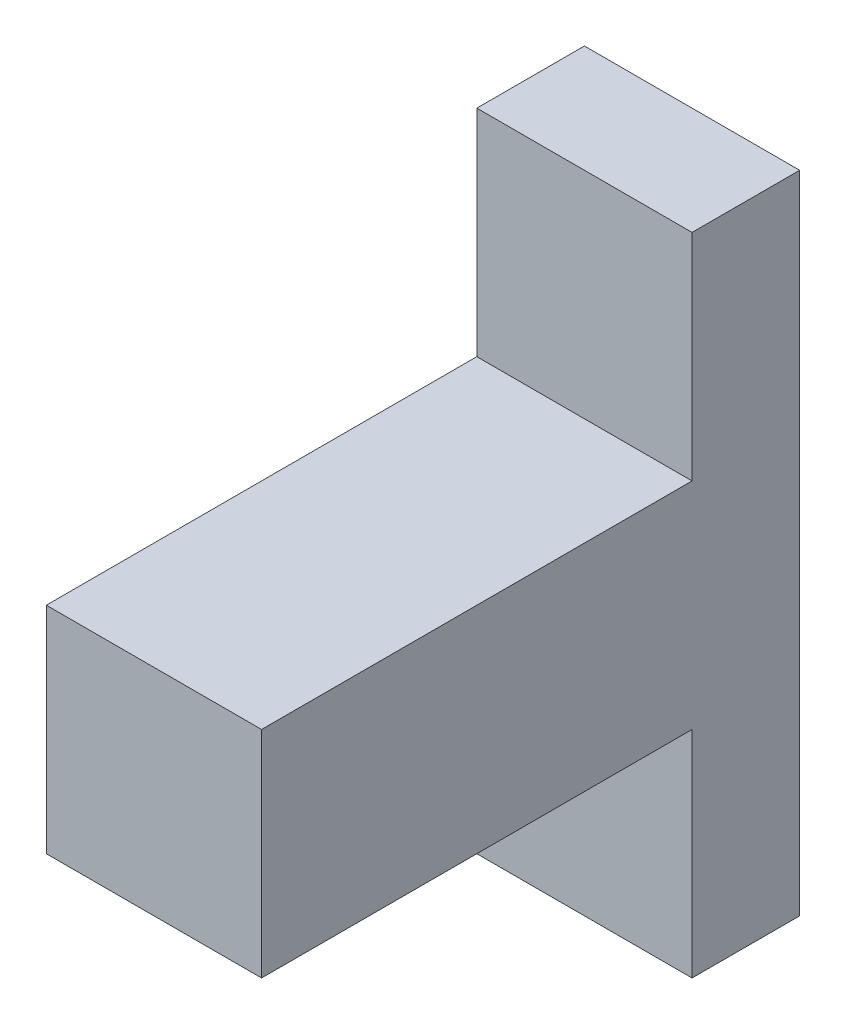
ISO-10303-21;
HEADER;
FILE_DESCRIPTION(('STEP AP214'),'2;1');
FILE_NAME('part.step','',(''),(''),'','','');
FILE_SCHEMA(('AUTOMOTIVE_DESIGN { 1 0 10303 214 1 1 1 1 }'));
ENDSEC;
DATA;
#1=APPLICATION_CONTEXT('core data for automotive mechanical design processes');
#2=APPLICATION_PROTOCOL_DEFINITION('international standard','automotive_design',2000,#1);
#3=PRODUCT_CONTEXT('',#1,'mechanical');
#4=PRODUCT('Part','Part','',(#3));
#5=PRODUCT_RELATED_PRODUCT_CATEGORY('part','',(#4));
#6=PRODUCT_DEFINITION_FORMATION('','',#4);
#7=PRODUCT_DEFINITION_CONTEXT('part definition',#1,'design');
#8=PRODUCT_DEFINITION('design','',#6,#7);
#9=PRODUCT_DEFINITION_SHAPE('','',#8);
#10=(LENGTH_UNIT() NAMED_UNIT(*) SI_UNIT(.MILLI.,.METRE.));
#11=(NAMED_UNIT(*) PLANE_ANGLE_UNIT() SI_UNIT($,.RADIAN.));
#12=(NAMED_UNIT(*) SI_UNIT($,.STERADIAN.) SOLID_ANGLE_UNIT());
#13=UNCERTAINTY_MEASURE_WITH_UNIT(LENGTH_MEASURE(1.E-05),#10,'distance_accuracy_value','');
#14=(GEOMETRIC_REPRESENTATION_CONTEXT(3) GLOBAL_UNCERTAINTY_ASSIGNED_CONTEXT((#13)) GLOBAL_UNIT_ASSIGNED_CONTEXT((#10,
#11,#12)) REPRESENTATION_CONTEXT('',''));
#15=CARTESIAN_POINT('',(0.,0.,0.));
#16=DIRECTION('',(0.,0.,1.));
#17=DIRECTION('',(1.,0.,0.));
#18=AXIS2_PLACEMENT_3D('',#15,#16,#17);
#19=CARTESIAN_POINT('',(-10.,10.,50.));
#20=DIRECTION('',(0.,-1.,0.));
#21=DIRECTION('',(0.,0.,-1.));
#22=AXIS2_PLACEMENT_3D('',#19,#20,#21);
#23=PLANE('',#22);
#24=DIRECTION('',(1.,0.,0.));
#25=VECTOR('',#24,1.);
#26=CARTESIAN_POINT('',(-10.,10.,10.));
#27=LINE('',#26,#25);
#28=CARTESIAN_POINT('',(-10.,10.,10.));
#29=VERTEX_POINT('',#28);
#30=CARTESIAN_POINT('',(10.,10.,10.));
#31=VERTEX_POINT('',#30);
#32=EDGE_CURVE('E61',#29,#31,#27,.T.);
#33=ORIENTED_EDGE('',*,*,#32,.F.);
#34=DIRECTION('',(0.,0.,-1.));
#35=VECTOR('',#34,1.);
#36=CARTESIAN_POINT('',(-10.,10.,50.));
#37=LINE('',#36,#35);
#38=CARTESIAN_POINT('',(-10.,10.,50.));
#39=VERTEX_POINT('',#38);
#40=EDGE_CURVE('E46',#39,#29,#37,.T.);
#41=ORIENTED_EDGE('',*,*,#40,.F.);
#42=DIRECTION('',(-1.,0.,0.));
#43=VECTOR('',#42,1.);
#44=CARTESIAN_POINT('',(-10.,10.,50.));
#45=LINE('',#44,#43);
#46=CARTESIAN_POINT('',(10.,10.,50.));
#47=VERTEX_POINT('',#46);
#48=EDGE_CURVE('E186',#47,#39,#45,.T.);
#49=ORIENTED_EDGE('',*,*,#48,.F.);
#50=DIRECTION('',(0.,0.,-1.));
#51=VECTOR('',#50,1.);
#52=CARTESIAN_POINT('',(10.,10.,50.));
#53=LINE('',#52,#51);
#54=EDGE_CURVE('E11',#47,#31,#53,.T.);
#55=ORIENTED_EDGE('',*,*,#54,.T.);
#56=EDGE_LOOP('',(#33,#41,#49,#55));
#57=FACE_BOUND('',#56,.T.);
#58=ADVANCED_FACE('F37',(#57),#23,.F.);
#59=CARTESIAN_POINT('',(10.,10.,50.));
#60=DIRECTION('',(-1.,0.,0.));
#61=DIRECTION('',(0.,-1.,0.));
#62=AXIS2_PLACEMENT_3D('',#59,#60,#61);
#63=PLANE('',#62);
#64=DIRECTION('',(0.,1.,0.));
#65=VECTOR('',#64,1.);
#66=CARTESIAN_POINT('',(10.,10.,0.));
#67=LINE('',#66,#65);
#68=CARTESIAN_POINT('',(10.,-30.,0.));
#69=VERTEX_POINT('',#68);
#70=CARTESIAN_POINT('',(10.,30.,0.));
#71=VERTEX_POINT('',#70);
#72=EDGE_CURVE('E118',#69,#71,#67,.T.);
#73=ORIENTED_EDGE('',*,*,#72,.T.);
#74=DIRECTION('',(0.,0.,-1.));
#75=VECTOR('',#74,1.);
#76=CARTESIAN_POINT('',(10.,30.,0.));
#77=LINE('',#76,#75);
#78=CARTESIAN_POINT('',(10.,30.,10.));
#79=VERTEX_POINT('',#78);
#80=EDGE_CURVE('E197',#79,#71,#77,.T.);
#81=ORIENTED_EDGE('',*,*,#80,.F.);
#82=DIRECTION('',(0.,-1.,0.));
#83=VECTOR('',#82,1.);
#84=CARTESIAN_POINT('',(10.,30.,10.));
#85=LINE('',#84,#83);
#86=EDGE_CURVE('E177',#79,#31,#85,.T.);
#87=ORIENTED_EDGE('',*,*,#86,.T.);
#88=ORIENTED_EDGE('',*,*,#54,.F.);
#89=DIRECTION('',(0.,1.,0.));
#90=VECTOR('',#89,1.);
#91=CARTESIAN_POINT('',(10.,10.,50.));
#92=LINE('',#91,#90);
#93=CARTESIAN_POINT('',(10.,-10.,50.));
#94=VERTEX_POINT('',#93);
#95=EDGE_CURVE('E117',#94,#47,#92,.T.);
#96=ORIENTED_EDGE('',*,*,#95,.F.);
#97=DIRECTION('',(0.,0.,-1.));
#98=VECTOR('',#97,1.);
#99=CARTESIAN_POINT('',(10.,-10.,50.));
#100=LINE('',#99,#98);
#101=CARTESIAN_POINT('',(10.,-10.,10.));
#102=VERTEX_POINT('',#101);
#103=EDGE_CURVE('E157',#94,#102,#100,.T.);
#104=ORIENTED_EDGE('',*,*,#103,.T.);
#105=DIRECTION('',(0.,1.,0.));
#106=VECTOR('',#105,1.);
#107=CARTESIAN_POINT('',(10.,-30.,10.));
#108=LINE('',#107,#106);
#109=CARTESIAN_POINT('',(10.,-30.,10.));
#110=VERTEX_POINT('',#109);
#111=EDGE_CURVE('E54',#110,#102,#108,.T.);
#112=ORIENTED_EDGE('',*,*,#111,.F.);
#113=DIRECTION('',(0.,0.,-1.));
#114=VECTOR('',#113,1.);
#115=CARTESIAN_POINT('',(10.,-30.,0.));
#116=LINE('',#115,#114);
#117=EDGE_CURVE('E130',#110,#69,#116,.T.);
#118=ORIENTED_EDGE('',*,*,#117,.T.);
#119=EDGE_LOOP('',(#73,#81,#87,#88,#96,#104,#112,#118));
#120=FACE_BOUND('',#119,.T.);
#121=ADVANCED_FACE('F39',(#120),#63,.F.);
#122=CARTESIAN_POINT('',(-10.,10.,50.));
#123=DIRECTION('',(1.,0.,0.));
#124=DIRECTION('',(0.,1.,0.));
#125=AXIS2_PLACEMENT_3D('',#122,#123,#124);
#126=PLANE('',#125);
#127=DIRECTION('',(0.,-1.,0.));
#128=VECTOR('',#127,1.);
#129=CARTESIAN_POINT('',(-10.,10.,0.));
#130=LINE('',#129,#128);
#131=CARTESIAN_POINT('',(-10.,30.,0.));
#132=VERTEX_POINT('',#131);
#133=CARTESIAN_POINT('',(-10.,-30.,0.));
#134=VERTEX_POINT('',#133);
#135=EDGE_CURVE('E105',#132,#134,#130,.T.);
#136=ORIENTED_EDGE('',*,*,#135,.T.);
#137=DIRECTION('',(0.,0.,1.));
#138=VECTOR('',#137,1.);
#139=CARTESIAN_POINT('',(-10.,-30.,0.));
#140=LINE('',#139,#138);
#141=CARTESIAN_POINT('',(-10.,-30.,10.));
#142=VERTEX_POINT('',#141);
#143=EDGE_CURVE('E108',#134,#142,#140,.T.);
#144=ORIENTED_EDGE('',*,*,#143,.T.);
#145=DIRECTION('',(0.,1.,0.));
#146=VECTOR('',#145,1.);
#147=CARTESIAN_POINT('',(-10.,-30.,10.));
#148=LINE('',#147,#146);
#149=CARTESIAN_POINT('',(-10.,-10.,10.));
#150=VERTEX_POINT('',#149);
#151=EDGE_CURVE('E135',#142,#150,#148,.T.);
#152=ORIENTED_EDGE('',*,*,#151,.T.);
#153=DIRECTION('',(0.,0.,-1.));
#154=VECTOR('',#153,1.);
#155=CARTESIAN_POINT('',(-10.,-10.,50.));
#156=LINE('',#155,#154);
#157=CARTESIAN_POINT('',(-10.,-10.,50.));
#158=VERTEX_POINT('',#157);
#159=EDGE_CURVE('E142',#158,#150,#156,.T.);
#160=ORIENTED_EDGE('',*,*,#159,.F.);
#161=DIRECTION('',(0.,-1.,0.));
#162=VECTOR('',#161,1.);
#163=CARTESIAN_POINT('',(-10.,10.,50.));
#164=LINE('',#163,#162);
#165=EDGE_CURVE('E161',#39,#158,#164,.T.);
#166=ORIENTED_EDGE('',*,*,#165,.F.);
#167=ORIENTED_EDGE('',*,*,#40,.T.);
#168=DIRECTION('',(0.,-1.,0.));
#169=VECTOR('',#168,1.);
#170=CARTESIAN_POINT('',(-10.,30.,10.));
#171=LINE('',#170,#169);
#172=CARTESIAN_POINT('',(-10.,30.,10.));
#173=VERTEX_POINT('',#172);
#174=EDGE_CURVE('E188',#173,#29,#171,.T.);
#175=ORIENTED_EDGE('',*,*,#174,.F.);
#176=DIRECTION('',(0.,0.,1.));
#177=VECTOR('',#176,1.);
#178=CARTESIAN_POINT('',(-10.,30.,0.));
#179=LINE('',#178,#177);
#180=EDGE_CURVE('E112',#132,#173,#179,.T.);
#181=ORIENTED_EDGE('',*,*,#180,.F.);
#182=EDGE_LOOP('',(#136,#144,#152,#160,#166,#167,#175,#181));
#183=FACE_BOUND('',#182,.T.);
#184=ADVANCED_FACE('F107',(#183),#126,.F.);
#185=CARTESIAN_POINT('',(-10.,-10.,50.));
#186=DIRECTION('',(0.,1.,0.));
#187=DIRECTION('',(0.,0.,1.));
#188=AXIS2_PLACEMENT_3D('',#185,#186,#187);
#189=PLANE('',#188);
#190=ORIENTED_EDGE('',*,*,#159,.T.);
#191=DIRECTION('',(1.,0.,0.));
#192=VECTOR('',#191,1.);
#193=CARTESIAN_POINT('',(-10.,-10.,10.));
#194=LINE('',#193,#192);
#195=EDGE_CURVE('E127',#150,#102,#194,.T.);
#196=ORIENTED_EDGE('',*,*,#195,.T.);
#197=ORIENTED_EDGE('',*,*,#103,.F.);
#198=DIRECTION('',(1.,0.,0.));
#199=VECTOR('',#198,1.);
#200=CARTESIAN_POINT('',(-10.,-10.,50.));
#201=LINE('',#200,#199);
#202=EDGE_CURVE('E156',#158,#94,#201,.T.);
#203=ORIENTED_EDGE('',*,*,#202,.F.);
#204=EDGE_LOOP('',(#190,#196,#197,#203));
#205=FACE_BOUND('',#204,.T.);
#206=ADVANCED_FACE('F155',(#205),#189,.F.);
#207=CARTESIAN_POINT('',(0.,0.,50.));
#208=DIRECTION('',(0.,0.,1.));
#209=DIRECTION('',(1.,0.,0.));
#210=AXIS2_PLACEMENT_3D('',#207,#208,#209);
#211=PLANE('',#210);
#212=ORIENTED_EDGE('',*,*,#95,.T.);
#213=ORIENTED_EDGE('',*,*,#48,.T.);
#214=ORIENTED_EDGE('',*,*,#165,.T.);
#215=ORIENTED_EDGE('',*,*,#202,.T.);
#216=EDGE_LOOP('',(#212,#213,#214,#215));
#217=FACE_BOUND('',#216,.T.);
#218=ADVANCED_FACE('F202',(#217),#211,.T.);
#219=CARTESIAN_POINT('',(0.,0.,0.));
#220=DIRECTION('',(0.,0.,1.));
#221=DIRECTION('',(1.,0.,0.));
#222=AXIS2_PLACEMENT_3D('',#219,#220,#221);
#223=PLANE('',#222);
#224=ORIENTED_EDGE('',*,*,#72,.F.);
#225=DIRECTION('',(-1.,0.,0.));
#226=VECTOR('',#225,1.);
#227=CARTESIAN_POINT('',(-10.,-30.,0.));
#228=LINE('',#227,#226);
#229=EDGE_CURVE('E124',#69,#134,#228,.T.);
#230=ORIENTED_EDGE('',*,*,#229,.T.);
#231=ORIENTED_EDGE('',*,*,#135,.F.);
#232=DIRECTION('',(-1.,0.,0.));
#233=VECTOR('',#232,1.);
#234=CARTESIAN_POINT('',(-10.,30.,0.));
#235=LINE('',#234,#233);
#236=EDGE_CURVE('E182',#71,#132,#235,.T.);
#237=ORIENTED_EDGE('',*,*,#236,.F.);
#238=EDGE_LOOP('',(#224,#230,#231,#237));
#239=FACE_BOUND('',#238,.T.);
#240=ADVANCED_FACE('F129',(#239),#223,.F.);
#241=CARTESIAN_POINT('',(-10.,30.,10.));
#242=DIRECTION('',(0.,0.,-1.));
#243=DIRECTION('',(-1.,0.,0.));
#244=AXIS2_PLACEMENT_3D('',#241,#242,#243);
#245=PLANE('',#244);
#246=ORIENTED_EDGE('',*,*,#32,.T.);
#247=ORIENTED_EDGE('',*,*,#86,.F.);
#248=DIRECTION('',(1.,0.,0.));
#249=VECTOR('',#248,1.);
#250=CARTESIAN_POINT('',(-10.,30.,10.));
#251=LINE('',#250,#249);
#252=EDGE_CURVE('E199',#173,#79,#251,.T.);
#253=ORIENTED_EDGE('',*,*,#252,.F.);
#254=ORIENTED_EDGE('',*,*,#174,.T.);
#255=EDGE_LOOP('',(#246,#247,#253,#254));
#256=FACE_BOUND('',#255,.T.);
#257=ADVANCED_FACE('F216',(#256),#245,.F.);
#258=CARTESIAN_POINT('',(0.,30.,0.));
#259=DIRECTION('',(0.,1.,0.));
#260=DIRECTION('',(0.,0.,1.));
#261=AXIS2_PLACEMENT_3D('',#258,#259,#260);
#262=PLANE('',#261);
#263=ORIENTED_EDGE('',*,*,#180,.T.);
#264=ORIENTED_EDGE('',*,*,#252,.T.);
#265=ORIENTED_EDGE('',*,*,#80,.T.);
#266=ORIENTED_EDGE('',*,*,#236,.T.);
#267=EDGE_LOOP('',(#263,#264,#265,#266));
#268=FACE_BOUND('',#267,.T.);
#269=ADVANCED_FACE('F200',(#268),#262,.T.);
#270=CARTESIAN_POINT('',(-10.,-30.,10.));
#271=DIRECTION('',(0.,0.,1.));
#272=DIRECTION('',(1.,0.,0.));
#273=AXIS2_PLACEMENT_3D('',#270,#271,#272);
#274=PLANE('',#273);
#275=ORIENTED_EDGE('',*,*,#195,.F.);
#276=ORIENTED_EDGE('',*,*,#151,.F.);
#277=DIRECTION('',(1.,0.,0.));
#278=VECTOR('',#277,1.);
#279=CARTESIAN_POINT('',(-10.,-30.,10.));
#280=LINE('',#279,#278);
#281=EDGE_CURVE('E126',#142,#110,#280,.T.);
#282=ORIENTED_EDGE('',*,*,#281,.T.);
#283=ORIENTED_EDGE('',*,*,#111,.T.);
#284=EDGE_LOOP('',(#275,#276,#282,#283));
#285=FACE_BOUND('',#284,.T.);
#286=ADVANCED_FACE('F151',(#285),#274,.T.);
#287=CARTESIAN_POINT('',(0.,-30.,0.));
#288=DIRECTION('',(0.,-1.,0.));
#289=DIRECTION('',(0.,0.,1.));
#290=AXIS2_PLACEMENT_3D('',#287,#288,#289);
#291=PLANE('',#290);
#292=ORIENTED_EDGE('',*,*,#143,.F.);
#293=ORIENTED_EDGE('',*,*,#229,.F.);
#294=ORIENTED_EDGE('',*,*,#117,.F.);
#295=ORIENTED_EDGE('',*,*,#281,.F.);
#296=EDGE_LOOP('',(#292,#293,#294,#295));
#297=FACE_BOUND('',#296,.T.);
#298=ADVANCED_FACE('F122',(#297),#291,.T.);
#299=CLOSED_SHELL('',(#58,#121,#184,#206,#218,#240,#257,#269,#286,#298));
#300=MANIFOLD_SOLID_BREP('B2',#299);
#301=ADVANCED_BREP_SHAPE_REPRESENTATION('',(#18,#300),#14);
#302=SHAPE_DEFINITION_REPRESENTATION(#9,#301);
ENDSEC;
END-ISO-10303-21;
